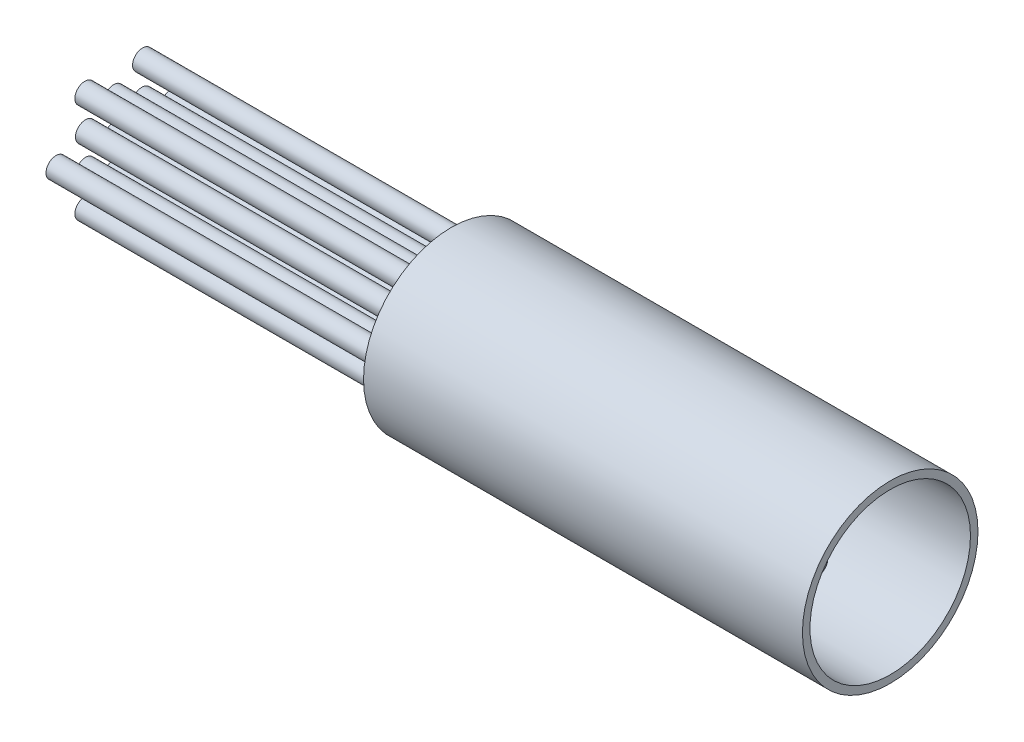
ISO-10303-21;
HEADER;
FILE_DESCRIPTION(('STEP AP214'),'2;1');
FILE_NAME('part.step','',(''),(''),'','','');
FILE_SCHEMA(('AUTOMOTIVE_DESIGN { 1 0 10303 214 1 1 1 1 }'));
ENDSEC;
DATA;
#1=APPLICATION_CONTEXT('core data for automotive mechanical design processes');
#2=APPLICATION_PROTOCOL_DEFINITION('international standard','automotive_design',2000,#1);
#3=PRODUCT_CONTEXT('',#1,'mechanical');
#4=PRODUCT('Part','Part','',(#3));
#5=PRODUCT_RELATED_PRODUCT_CATEGORY('part','',(#4));
#6=PRODUCT_DEFINITION_FORMATION('','',#4);
#7=PRODUCT_DEFINITION_CONTEXT('part definition',#1,'design');
#8=PRODUCT_DEFINITION('design','',#6,#7);
#9=PRODUCT_DEFINITION_SHAPE('','',#8);
#10=(LENGTH_UNIT() NAMED_UNIT(*) SI_UNIT(.MILLI.,.METRE.));
#11=(NAMED_UNIT(*) PLANE_ANGLE_UNIT() SI_UNIT($,.RADIAN.));
#12=(NAMED_UNIT(*) SI_UNIT($,.STERADIAN.) SOLID_ANGLE_UNIT());
#13=UNCERTAINTY_MEASURE_WITH_UNIT(LENGTH_MEASURE(1.E-05),#10,'distance_accuracy_value','');
#14=(GEOMETRIC_REPRESENTATION_CONTEXT(3) GLOBAL_UNCERTAINTY_ASSIGNED_CONTEXT((#13)) GLOBAL_UNIT_ASSIGNED_CONTEXT((#10,
#11,#12)) REPRESENTATION_CONTEXT('',''));
#15=CARTESIAN_POINT('',(0.,0.,0.));
#16=DIRECTION('',(0.,0.,1.));
#17=DIRECTION('',(1.,0.,0.));
#18=AXIS2_PLACEMENT_3D('',#15,#16,#17);
#19=CARTESIAN_POINT('',(-134.6,19.9185842870421,-11.4999999999999));
#20=DIRECTION('',(-1.,0.,0.));
#21=DIRECTION('',(0.,0.,1.));
#22=AXIS2_PLACEMENT_3D('',#19,#20,#21);
#23=PLANE('',#22);
#24=CARTESIAN_POINT('',(-134.6,19.9185842870421,-11.4999999999999));
#25=DIRECTION('',(-1.,0.,0.));
#26=DIRECTION('',(0.,0.,1.));
#27=AXIS2_PLACEMENT_3D('',#24,#25,#26);
#28=CIRCLE('',#27,4.);
#29=CARTESIAN_POINT('',(-134.6,19.9185842870421,-7.49999999999989));
#30=VERTEX_POINT('',#29);
#31=EDGE_CURVE('E11',#30,#30,#28,.T.);
#32=ORIENTED_EDGE('',*,*,#31,.T.);
#33=EDGE_LOOP('',(#32));
#34=FACE_BOUND('',#33,.T.);
#35=CARTESIAN_POINT('',(-134.6,19.9185842870421,-11.4999999999999));
#36=DIRECTION('',(-1.,0.,0.));
#37=DIRECTION('',(0.,0.,1.));
#38=AXIS2_PLACEMENT_3D('',#35,#36,#37);
#39=CIRCLE('',#38,3.00000000000001);
#40=CARTESIAN_POINT('',(-134.6,19.9185842870421,-8.49999999999988));
#41=VERTEX_POINT('',#40);
#42=EDGE_CURVE('E50',#41,#41,#39,.T.);
#43=ORIENTED_EDGE('',*,*,#42,.F.);
#44=EDGE_LOOP('',(#43));
#45=FACE_BOUND('',#44,.T.);
#46=ADVANCED_FACE('F43',(#34,#45),#23,.T.);
#47=CARTESIAN_POINT('',(-134.6,19.9185842870421,-11.4999999999999));
#48=DIRECTION('',(1.,0.,0.));
#49=DIRECTION('',(0.,0.,-1.));
#50=AXIS2_PLACEMENT_3D('',#47,#48,#49);
#51=CYLINDRICAL_SURFACE('',#50,4.);
#52=ORIENTED_EDGE('',*,*,#31,.F.);
#53=EDGE_LOOP('',(#52));
#54=FACE_BOUND('',#53,.T.);
#55=CARTESIAN_POINT('',(134.6,19.9185842870421,-11.4999999999999));
#56=DIRECTION('',(-1.,0.,0.));
#57=DIRECTION('',(0.,0.,1.));
#58=AXIS2_PLACEMENT_3D('',#55,#56,#57);
#59=CIRCLE('',#58,4.);
#60=CARTESIAN_POINT('',(134.6,19.9185842870421,-7.49999999999989));
#61=VERTEX_POINT('',#60);
#62=EDGE_CURVE('E54',#61,#61,#59,.T.);
#63=ORIENTED_EDGE('',*,*,#62,.T.);
#64=EDGE_LOOP('',(#63));
#65=FACE_BOUND('',#64,.T.);
#66=ADVANCED_FACE('F45',(#54,#65),#51,.T.);
#67=CARTESIAN_POINT('',(-134.6,19.9185842870421,-11.4999999999999));
#68=DIRECTION('',(1.,0.,0.));
#69=DIRECTION('',(0.,0.,-1.));
#70=AXIS2_PLACEMENT_3D('',#67,#68,#69);
#71=CYLINDRICAL_SURFACE('',#70,3.00000000000001);
#72=ORIENTED_EDGE('',*,*,#42,.T.);
#73=EDGE_LOOP('',(#72));
#74=FACE_BOUND('',#73,.T.);
#75=CARTESIAN_POINT('',(134.6,19.9185842870421,-11.4999999999999));
#76=DIRECTION('',(-1.,0.,0.));
#77=DIRECTION('',(0.,0.,1.));
#78=AXIS2_PLACEMENT_3D('',#75,#76,#77);
#79=CIRCLE('',#78,3.00000000000001);
#80=CARTESIAN_POINT('',(134.6,19.9185842870421,-8.49999999999988));
#81=VERTEX_POINT('',#80);
#82=EDGE_CURVE('E58',#81,#81,#79,.T.);
#83=ORIENTED_EDGE('',*,*,#82,.F.);
#84=EDGE_LOOP('',(#83));
#85=FACE_BOUND('',#84,.T.);
#86=ADVANCED_FACE('F67',(#74,#85),#71,.F.);
#87=CARTESIAN_POINT('',(134.6,19.9185842870421,-11.4999999999999));
#88=DIRECTION('',(-1.,0.,0.));
#89=DIRECTION('',(0.,0.,1.));
#90=AXIS2_PLACEMENT_3D('',#87,#88,#89);
#91=PLANE('',#90);
#92=ORIENTED_EDGE('',*,*,#82,.T.);
#93=EDGE_LOOP('',(#92));
#94=FACE_BOUND('',#93,.T.);
#95=ORIENTED_EDGE('',*,*,#62,.F.);
#96=EDGE_LOOP('',(#95));
#97=FACE_BOUND('',#96,.T.);
#98=ADVANCED_FACE('F64',(#94,#97),#91,.F.);
#99=CLOSED_SHELL('',(#46,#66,#86,#98));
#100=MANIFOLD_SOLID_BREP('B2',#99);
#101=CARTESIAN_POINT('',(-134.6,1.24544042034318E-13,-23.));
#102=DIRECTION('',(-1.,0.,0.));
#103=DIRECTION('',(0.,0.,1.));
#104=AXIS2_PLACEMENT_3D('',#101,#102,#103);
#105=PLANE('',#104);
#106=CARTESIAN_POINT('',(-134.6,1.24544042034318E-13,-23.));
#107=DIRECTION('',(-1.,0.,0.));
#108=DIRECTION('',(0.,0.,1.));
#109=AXIS2_PLACEMENT_3D('',#106,#107,#108);
#110=CIRCLE('',#109,4.);
#111=CARTESIAN_POINT('',(-134.6,1.24544042034318E-13,-19.));
#112=VERTEX_POINT('',#111);
#113=EDGE_CURVE('E42',#112,#112,#110,.T.);
#114=ORIENTED_EDGE('',*,*,#113,.T.);
#115=EDGE_LOOP('',(#114));
#116=FACE_BOUND('',#115,.T.);
#117=CARTESIAN_POINT('',(-134.6,1.24544042034318E-13,-23.));
#118=DIRECTION('',(-1.,0.,0.));
#119=DIRECTION('',(0.,0.,1.));
#120=AXIS2_PLACEMENT_3D('',#117,#118,#119);
#121=CIRCLE('',#120,3.);
#122=CARTESIAN_POINT('',(-134.6,1.24544042034318E-13,-20.));
#123=VERTEX_POINT('',#122);
#124=EDGE_CURVE('E119',#123,#123,#121,.T.);
#125=ORIENTED_EDGE('',*,*,#124,.F.);
#126=EDGE_LOOP('',(#125));
#127=FACE_BOUND('',#126,.T.);
#128=ADVANCED_FACE('F112',(#116,#127),#105,.T.);
#129=CARTESIAN_POINT('',(-134.6,1.24544042034318E-13,-23.));
#130=DIRECTION('',(1.,0.,0.));
#131=DIRECTION('',(0.,0.,-1.));
#132=AXIS2_PLACEMENT_3D('',#129,#130,#131);
#133=CYLINDRICAL_SURFACE('',#132,4.);
#134=ORIENTED_EDGE('',*,*,#113,.F.);
#135=EDGE_LOOP('',(#134));
#136=FACE_BOUND('',#135,.T.);
#137=CARTESIAN_POINT('',(134.6,1.24544042034318E-13,-23.));
#138=DIRECTION('',(-1.,0.,0.));
#139=DIRECTION('',(0.,0.,1.));
#140=AXIS2_PLACEMENT_3D('',#137,#138,#139);
#141=CIRCLE('',#140,4.);
#142=CARTESIAN_POINT('',(134.6,1.24544042034318E-13,-19.));
#143=VERTEX_POINT('',#142);
#144=EDGE_CURVE('E123',#143,#143,#141,.T.);
#145=ORIENTED_EDGE('',*,*,#144,.T.);
#146=EDGE_LOOP('',(#145));
#147=FACE_BOUND('',#146,.T.);
#148=ADVANCED_FACE('F114',(#136,#147),#133,.T.);
#149=CARTESIAN_POINT('',(-134.6,1.24544042034318E-13,-23.));
#150=DIRECTION('',(1.,0.,0.));
#151=DIRECTION('',(0.,0.,-1.));
#152=AXIS2_PLACEMENT_3D('',#149,#150,#151);
#153=CYLINDRICAL_SURFACE('',#152,3.);
#154=ORIENTED_EDGE('',*,*,#124,.T.);
#155=EDGE_LOOP('',(#154));
#156=FACE_BOUND('',#155,.T.);
#157=CARTESIAN_POINT('',(134.6,1.24544042034318E-13,-23.));
#158=DIRECTION('',(-1.,0.,0.));
#159=DIRECTION('',(0.,0.,1.));
#160=AXIS2_PLACEMENT_3D('',#157,#158,#159);
#161=CIRCLE('',#160,3.);
#162=CARTESIAN_POINT('',(134.6,1.24544042034318E-13,-20.));
#163=VERTEX_POINT('',#162);
#164=EDGE_CURVE('E127',#163,#163,#161,.T.);
#165=ORIENTED_EDGE('',*,*,#164,.F.);
#166=EDGE_LOOP('',(#165));
#167=FACE_BOUND('',#166,.T.);
#168=ADVANCED_FACE('F136',(#156,#167),#153,.F.);
#169=CARTESIAN_POINT('',(134.6,1.24544042034318E-13,-23.));
#170=DIRECTION('',(-1.,0.,0.));
#171=DIRECTION('',(0.,0.,1.));
#172=AXIS2_PLACEMENT_3D('',#169,#170,#171);
#173=PLANE('',#172);
#174=ORIENTED_EDGE('',*,*,#164,.T.);
#175=EDGE_LOOP('',(#174));
#176=FACE_BOUND('',#175,.T.);
#177=ORIENTED_EDGE('',*,*,#144,.F.);
#178=EDGE_LOOP('',(#177));
#179=FACE_BOUND('',#178,.T.);
#180=ADVANCED_FACE('F133',(#176,#179),#173,.F.);
#181=CLOSED_SHELL('',(#128,#148,#168,#180));
#182=MANIFOLD_SOLID_BREP('B6',#181);
#183=CARTESIAN_POINT('',(-134.6,-19.918584287042,-11.5000000000001));
#184=DIRECTION('',(-1.,0.,0.));
#185=DIRECTION('',(0.,0.,1.));
#186=AXIS2_PLACEMENT_3D('',#183,#184,#185);
#187=PLANE('',#186);
#188=CARTESIAN_POINT('',(-134.6,-19.918584287042,-11.5000000000001));
#189=DIRECTION('',(-1.,0.,0.));
#190=DIRECTION('',(0.,0.,1.));
#191=AXIS2_PLACEMENT_3D('',#188,#189,#190);
#192=CIRCLE('',#191,4.);
#193=CARTESIAN_POINT('',(-134.6,-19.918584287042,-7.5000000000001));
#194=VERTEX_POINT('',#193);
#195=EDGE_CURVE('E111',#194,#194,#192,.T.);
#196=ORIENTED_EDGE('',*,*,#195,.T.);
#197=EDGE_LOOP('',(#196));
#198=FACE_BOUND('',#197,.T.);
#199=CARTESIAN_POINT('',(-134.6,-19.918584287042,-11.5000000000001));
#200=DIRECTION('',(-1.,0.,0.));
#201=DIRECTION('',(0.,0.,1.));
#202=AXIS2_PLACEMENT_3D('',#199,#200,#201);
#203=CIRCLE('',#202,3.00000000000001);
#204=CARTESIAN_POINT('',(-134.6,-19.918584287042,-8.5000000000001));
#205=VERTEX_POINT('',#204);
#206=EDGE_CURVE('E188',#205,#205,#203,.T.);
#207=ORIENTED_EDGE('',*,*,#206,.F.);
#208=EDGE_LOOP('',(#207));
#209=FACE_BOUND('',#208,.T.);
#210=ADVANCED_FACE('F181',(#198,#209),#187,.T.);
#211=CARTESIAN_POINT('',(-134.6,-19.918584287042,-11.5000000000001));
#212=DIRECTION('',(1.,0.,0.));
#213=DIRECTION('',(0.,0.,-1.));
#214=AXIS2_PLACEMENT_3D('',#211,#212,#213);
#215=CYLINDRICAL_SURFACE('',#214,4.);
#216=ORIENTED_EDGE('',*,*,#195,.F.);
#217=EDGE_LOOP('',(#216));
#218=FACE_BOUND('',#217,.T.);
#219=CARTESIAN_POINT('',(134.6,-19.918584287042,-11.5000000000001));
#220=DIRECTION('',(-1.,0.,0.));
#221=DIRECTION('',(0.,0.,1.));
#222=AXIS2_PLACEMENT_3D('',#219,#220,#221);
#223=CIRCLE('',#222,4.);
#224=CARTESIAN_POINT('',(134.6,-19.918584287042,-7.5000000000001));
#225=VERTEX_POINT('',#224);
#226=EDGE_CURVE('E192',#225,#225,#223,.T.);
#227=ORIENTED_EDGE('',*,*,#226,.T.);
#228=EDGE_LOOP('',(#227));
#229=FACE_BOUND('',#228,.T.);
#230=ADVANCED_FACE('F183',(#218,#229),#215,.T.);
#231=CARTESIAN_POINT('',(-134.6,-19.918584287042,-11.5000000000001));
#232=DIRECTION('',(1.,0.,0.));
#233=DIRECTION('',(0.,0.,-1.));
#234=AXIS2_PLACEMENT_3D('',#231,#232,#233);
#235=CYLINDRICAL_SURFACE('',#234,3.00000000000001);
#236=ORIENTED_EDGE('',*,*,#206,.T.);
#237=EDGE_LOOP('',(#236));
#238=FACE_BOUND('',#237,.T.);
#239=CARTESIAN_POINT('',(134.6,-19.918584287042,-11.5000000000001));
#240=DIRECTION('',(-1.,0.,0.));
#241=DIRECTION('',(0.,0.,1.));
#242=AXIS2_PLACEMENT_3D('',#239,#240,#241);
#243=CIRCLE('',#242,3.00000000000001);
#244=CARTESIAN_POINT('',(134.6,-19.918584287042,-8.5000000000001));
#245=VERTEX_POINT('',#244);
#246=EDGE_CURVE('E196',#245,#245,#243,.T.);
#247=ORIENTED_EDGE('',*,*,#246,.F.);
#248=EDGE_LOOP('',(#247));
#249=FACE_BOUND('',#248,.T.);
#250=ADVANCED_FACE('F205',(#238,#249),#235,.F.);
#251=CARTESIAN_POINT('',(134.6,-19.918584287042,-11.5000000000001));
#252=DIRECTION('',(-1.,0.,0.));
#253=DIRECTION('',(0.,0.,1.));
#254=AXIS2_PLACEMENT_3D('',#251,#252,#253);
#255=PLANE('',#254);
#256=ORIENTED_EDGE('',*,*,#246,.T.);
#257=EDGE_LOOP('',(#256));
#258=FACE_BOUND('',#257,.T.);
#259=ORIENTED_EDGE('',*,*,#226,.F.);
#260=EDGE_LOOP('',(#259));
#261=FACE_BOUND('',#260,.T.);
#262=ADVANCED_FACE('F202',(#258,#261),#255,.F.);
#263=CLOSED_SHELL('',(#210,#230,#250,#262));
#264=MANIFOLD_SOLID_BREP('B37',#263);
#265=CARTESIAN_POINT('',(-134.6,-19.9185842870422,11.4999999999999));
#266=DIRECTION('',(-1.,0.,0.));
#267=DIRECTION('',(0.,0.,1.));
#268=AXIS2_PLACEMENT_3D('',#265,#266,#267);
#269=PLANE('',#268);
#270=CARTESIAN_POINT('',(-134.6,-19.9185842870422,11.4999999999999));
#271=DIRECTION('',(-1.,0.,0.));
#272=DIRECTION('',(0.,0.,1.));
#273=AXIS2_PLACEMENT_3D('',#270,#271,#272);
#274=CIRCLE('',#273,4.);
#275=CARTESIAN_POINT('',(-134.6,-19.9185842870422,15.4999999999999));
#276=VERTEX_POINT('',#275);
#277=EDGE_CURVE('E180',#276,#276,#274,.T.);
#278=ORIENTED_EDGE('',*,*,#277,.T.);
#279=EDGE_LOOP('',(#278));
#280=FACE_BOUND('',#279,.T.);
#281=CARTESIAN_POINT('',(-134.6,-19.9185842870422,11.4999999999999));
#282=DIRECTION('',(-1.,0.,0.));
#283=DIRECTION('',(0.,0.,1.));
#284=AXIS2_PLACEMENT_3D('',#281,#282,#283);
#285=CIRCLE('',#284,3.);
#286=CARTESIAN_POINT('',(-134.6,-19.9185842870422,14.4999999999999));
#287=VERTEX_POINT('',#286);
#288=EDGE_CURVE('E257',#287,#287,#285,.T.);
#289=ORIENTED_EDGE('',*,*,#288,.F.);
#290=EDGE_LOOP('',(#289));
#291=FACE_BOUND('',#290,.T.);
#292=ADVANCED_FACE('F250',(#280,#291),#269,.T.);
#293=CARTESIAN_POINT('',(-134.6,-19.9185842870422,11.4999999999999));
#294=DIRECTION('',(1.,0.,0.));
#295=DIRECTION('',(0.,0.,-1.));
#296=AXIS2_PLACEMENT_3D('',#293,#294,#295);
#297=CYLINDRICAL_SURFACE('',#296,4.);
#298=ORIENTED_EDGE('',*,*,#277,.F.);
#299=EDGE_LOOP('',(#298));
#300=FACE_BOUND('',#299,.T.);
#301=CARTESIAN_POINT('',(134.6,-19.9185842870422,11.4999999999999));
#302=DIRECTION('',(-1.,0.,0.));
#303=DIRECTION('',(0.,0.,1.));
#304=AXIS2_PLACEMENT_3D('',#301,#302,#303);
#305=CIRCLE('',#304,4.);
#306=CARTESIAN_POINT('',(134.6,-19.9185842870422,15.4999999999999));
#307=VERTEX_POINT('',#306);
#308=EDGE_CURVE('E261',#307,#307,#305,.T.);
#309=ORIENTED_EDGE('',*,*,#308,.T.);
#310=EDGE_LOOP('',(#309));
#311=FACE_BOUND('',#310,.T.);
#312=ADVANCED_FACE('F252',(#300,#311),#297,.T.);
#313=CARTESIAN_POINT('',(-134.6,-19.9185842870422,11.4999999999999));
#314=DIRECTION('',(1.,0.,0.));
#315=DIRECTION('',(0.,0.,-1.));
#316=AXIS2_PLACEMENT_3D('',#313,#314,#315);
#317=CYLINDRICAL_SURFACE('',#316,3.);
#318=ORIENTED_EDGE('',*,*,#288,.T.);
#319=EDGE_LOOP('',(#318));
#320=FACE_BOUND('',#319,.T.);
#321=CARTESIAN_POINT('',(134.6,-19.9185842870422,11.4999999999999));
#322=DIRECTION('',(-1.,0.,0.));
#323=DIRECTION('',(0.,0.,1.));
#324=AXIS2_PLACEMENT_3D('',#321,#322,#323);
#325=CIRCLE('',#324,3.);
#326=CARTESIAN_POINT('',(134.6,-19.9185842870422,14.4999999999999));
#327=VERTEX_POINT('',#326);
#328=EDGE_CURVE('E265',#327,#327,#325,.T.);
#329=ORIENTED_EDGE('',*,*,#328,.F.);
#330=EDGE_LOOP('',(#329));
#331=FACE_BOUND('',#330,.T.);
#332=ADVANCED_FACE('F274',(#320,#331),#317,.F.);
#333=CARTESIAN_POINT('',(134.6,-19.9185842870422,11.4999999999999));
#334=DIRECTION('',(-1.,0.,0.));
#335=DIRECTION('',(0.,0.,1.));
#336=AXIS2_PLACEMENT_3D('',#333,#334,#335);
#337=PLANE('',#336);
#338=ORIENTED_EDGE('',*,*,#328,.T.);
#339=EDGE_LOOP('',(#338));
#340=FACE_BOUND('',#339,.T.);
#341=ORIENTED_EDGE('',*,*,#308,.F.);
#342=EDGE_LOOP('',(#341));
#343=FACE_BOUND('',#342,.T.);
#344=ADVANCED_FACE('F271',(#340,#343),#337,.F.);
#345=CLOSED_SHELL('',(#292,#312,#332,#344));
#346=MANIFOLD_SOLID_BREP('B106',#345);
#347=CARTESIAN_POINT('',(-134.6,-1.24842197631751E-13,23.));
#348=DIRECTION('',(-1.,0.,0.));
#349=DIRECTION('',(0.,0.,1.));
#350=AXIS2_PLACEMENT_3D('',#347,#348,#349);
#351=PLANE('',#350);
#352=CARTESIAN_POINT('',(-134.6,-1.24842197631751E-13,23.));
#353=DIRECTION('',(-1.,0.,0.));
#354=DIRECTION('',(0.,0.,1.));
#355=AXIS2_PLACEMENT_3D('',#352,#353,#354);
#356=CIRCLE('',#355,4.);
#357=CARTESIAN_POINT('',(-134.6,-1.24842197631751E-13,27.));
#358=VERTEX_POINT('',#357);
#359=EDGE_CURVE('E249',#358,#358,#356,.T.);
#360=ORIENTED_EDGE('',*,*,#359,.T.);
#361=EDGE_LOOP('',(#360));
#362=FACE_BOUND('',#361,.T.);
#363=CARTESIAN_POINT('',(-134.6,-1.24842197631751E-13,23.));
#364=DIRECTION('',(-1.,0.,0.));
#365=DIRECTION('',(0.,0.,1.));
#366=AXIS2_PLACEMENT_3D('',#363,#364,#365);
#367=CIRCLE('',#366,3.);
#368=CARTESIAN_POINT('',(-134.6,-1.24842197631751E-13,26.));
#369=VERTEX_POINT('',#368);
#370=EDGE_CURVE('E326',#369,#369,#367,.T.);
#371=ORIENTED_EDGE('',*,*,#370,.F.);
#372=EDGE_LOOP('',(#371));
#373=FACE_BOUND('',#372,.T.);
#374=ADVANCED_FACE('F319',(#362,#373),#351,.T.);
#375=CARTESIAN_POINT('',(-134.6,-1.24842197631751E-13,23.));
#376=DIRECTION('',(1.,0.,0.));
#377=DIRECTION('',(0.,0.,-1.));
#378=AXIS2_PLACEMENT_3D('',#375,#376,#377);
#379=CYLINDRICAL_SURFACE('',#378,4.);
#380=ORIENTED_EDGE('',*,*,#359,.F.);
#381=EDGE_LOOP('',(#380));
#382=FACE_BOUND('',#381,.T.);
#383=CARTESIAN_POINT('',(134.6,-1.24842197631751E-13,23.));
#384=DIRECTION('',(-1.,0.,0.));
#385=DIRECTION('',(0.,0.,1.));
#386=AXIS2_PLACEMENT_3D('',#383,#384,#385);
#387=CIRCLE('',#386,4.);
#388=CARTESIAN_POINT('',(134.6,-1.24842197631751E-13,27.));
#389=VERTEX_POINT('',#388);
#390=EDGE_CURVE('E330',#389,#389,#387,.T.);
#391=ORIENTED_EDGE('',*,*,#390,.T.);
#392=EDGE_LOOP('',(#391));
#393=FACE_BOUND('',#392,.T.);
#394=ADVANCED_FACE('F321',(#382,#393),#379,.T.);
#395=CARTESIAN_POINT('',(-134.6,-1.24842197631751E-13,23.));
#396=DIRECTION('',(1.,0.,0.));
#397=DIRECTION('',(0.,0.,-1.));
#398=AXIS2_PLACEMENT_3D('',#395,#396,#397);
#399=CYLINDRICAL_SURFACE('',#398,3.);
#400=ORIENTED_EDGE('',*,*,#370,.T.);
#401=EDGE_LOOP('',(#400));
#402=FACE_BOUND('',#401,.T.);
#403=CARTESIAN_POINT('',(134.6,-1.24842197631751E-13,23.));
#404=DIRECTION('',(-1.,0.,0.));
#405=DIRECTION('',(0.,0.,1.));
#406=AXIS2_PLACEMENT_3D('',#403,#404,#405);
#407=CIRCLE('',#406,3.);
#408=CARTESIAN_POINT('',(134.6,-1.24842197631751E-13,26.));
#409=VERTEX_POINT('',#408);
#410=EDGE_CURVE('E334',#409,#409,#407,.T.);
#411=ORIENTED_EDGE('',*,*,#410,.F.);
#412=EDGE_LOOP('',(#411));
#413=FACE_BOUND('',#412,.T.);
#414=ADVANCED_FACE('F343',(#402,#413),#399,.F.);
#415=CARTESIAN_POINT('',(134.6,-1.24842197631751E-13,23.));
#416=DIRECTION('',(-1.,0.,0.));
#417=DIRECTION('',(0.,0.,1.));
#418=AXIS2_PLACEMENT_3D('',#415,#416,#417);
#419=PLANE('',#418);
#420=ORIENTED_EDGE('',*,*,#410,.T.);
#421=EDGE_LOOP('',(#420));
#422=FACE_BOUND('',#421,.T.);
#423=ORIENTED_EDGE('',*,*,#390,.F.);
#424=EDGE_LOOP('',(#423));
#425=FACE_BOUND('',#424,.T.);
#426=ADVANCED_FACE('F340',(#422,#425),#419,.F.);
#427=CLOSED_SHELL('',(#374,#394,#414,#426));
#428=MANIFOLD_SOLID_BREP('B175',#427);
#429=CARTESIAN_POINT('',(-134.6,19.918584287042,11.5000000000001));
#430=DIRECTION('',(-1.,0.,0.));
#431=DIRECTION('',(0.,0.,1.));
#432=AXIS2_PLACEMENT_3D('',#429,#430,#431);
#433=PLANE('',#432);
#434=CARTESIAN_POINT('',(-134.6,19.918584287042,11.5000000000001));
#435=DIRECTION('',(-1.,0.,0.));
#436=DIRECTION('',(0.,0.,1.));
#437=AXIS2_PLACEMENT_3D('',#434,#435,#436);
#438=CIRCLE('',#437,4.00000000000001);
#439=CARTESIAN_POINT('',(-134.6,19.918584287042,15.5000000000001));
#440=VERTEX_POINT('',#439);
#441=EDGE_CURVE('E318',#440,#440,#438,.T.);
#442=ORIENTED_EDGE('',*,*,#441,.T.);
#443=EDGE_LOOP('',(#442));
#444=FACE_BOUND('',#443,.T.);
#445=CARTESIAN_POINT('',(-134.6,19.918584287042,11.5000000000001));
#446=DIRECTION('',(-1.,0.,0.));
#447=DIRECTION('',(0.,0.,1.));
#448=AXIS2_PLACEMENT_3D('',#445,#446,#447);
#449=CIRCLE('',#448,3.00000000000001);
#450=CARTESIAN_POINT('',(-134.6,19.918584287042,14.5000000000001));
#451=VERTEX_POINT('',#450);
#452=EDGE_CURVE('E395',#451,#451,#449,.T.);
#453=ORIENTED_EDGE('',*,*,#452,.F.);
#454=EDGE_LOOP('',(#453));
#455=FACE_BOUND('',#454,.T.);
#456=ADVANCED_FACE('F388',(#444,#455),#433,.T.);
#457=CARTESIAN_POINT('',(-134.6,19.918584287042,11.5000000000001));
#458=DIRECTION('',(1.,0.,0.));
#459=DIRECTION('',(0.,0.,-1.));
#460=AXIS2_PLACEMENT_3D('',#457,#458,#459);
#461=CYLINDRICAL_SURFACE('',#460,4.00000000000001);
#462=ORIENTED_EDGE('',*,*,#441,.F.);
#463=EDGE_LOOP('',(#462));
#464=FACE_BOUND('',#463,.T.);
#465=CARTESIAN_POINT('',(134.6,19.918584287042,11.5000000000001));
#466=DIRECTION('',(-1.,0.,0.));
#467=DIRECTION('',(0.,0.,1.));
#468=AXIS2_PLACEMENT_3D('',#465,#466,#467);
#469=CIRCLE('',#468,4.00000000000001);
#470=CARTESIAN_POINT('',(134.6,19.918584287042,15.5000000000001));
#471=VERTEX_POINT('',#470);
#472=EDGE_CURVE('E399',#471,#471,#469,.T.);
#473=ORIENTED_EDGE('',*,*,#472,.T.);
#474=EDGE_LOOP('',(#473));
#475=FACE_BOUND('',#474,.T.);
#476=ADVANCED_FACE('F390',(#464,#475),#461,.T.);
#477=CARTESIAN_POINT('',(-134.6,19.918584287042,11.5000000000001));
#478=DIRECTION('',(1.,0.,0.));
#479=DIRECTION('',(0.,0.,-1.));
#480=AXIS2_PLACEMENT_3D('',#477,#478,#479);
#481=CYLINDRICAL_SURFACE('',#480,3.00000000000001);
#482=ORIENTED_EDGE('',*,*,#452,.T.);
#483=EDGE_LOOP('',(#482));
#484=FACE_BOUND('',#483,.T.);
#485=CARTESIAN_POINT('',(134.6,19.918584287042,11.5000000000001));
#486=DIRECTION('',(-1.,0.,0.));
#487=DIRECTION('',(0.,0.,1.));
#488=AXIS2_PLACEMENT_3D('',#485,#486,#487);
#489=CIRCLE('',#488,3.00000000000001);
#490=CARTESIAN_POINT('',(134.6,19.918584287042,14.5000000000001));
#491=VERTEX_POINT('',#490);
#492=EDGE_CURVE('E403',#491,#491,#489,.T.);
#493=ORIENTED_EDGE('',*,*,#492,.F.);
#494=EDGE_LOOP('',(#493));
#495=FACE_BOUND('',#494,.T.);
#496=ADVANCED_FACE('F412',(#484,#495),#481,.F.);
#497=CARTESIAN_POINT('',(134.6,19.918584287042,11.5000000000001));
#498=DIRECTION('',(-1.,0.,0.));
#499=DIRECTION('',(0.,0.,1.));
#500=AXIS2_PLACEMENT_3D('',#497,#498,#499);
#501=PLANE('',#500);
#502=ORIENTED_EDGE('',*,*,#492,.T.);
#503=EDGE_LOOP('',(#502));
#504=FACE_BOUND('',#503,.T.);
#505=ORIENTED_EDGE('',*,*,#472,.F.);
#506=EDGE_LOOP('',(#505));
#507=FACE_BOUND('',#506,.T.);
#508=ADVANCED_FACE('F409',(#504,#507),#501,.F.);
#509=CLOSED_SHELL('',(#456,#476,#496,#508));
#510=MANIFOLD_SOLID_BREP('B244',#509);
#511=CARTESIAN_POINT('',(-134.6,6.49999999999999,-11.2583302491977));
#512=DIRECTION('',(-1.,0.,0.));
#513=DIRECTION('',(0.,0.,1.));
#514=AXIS2_PLACEMENT_3D('',#511,#512,#513);
#515=PLANE('',#514);
#516=CARTESIAN_POINT('',(-134.6,6.49999999999999,-11.2583302491977));
#517=DIRECTION('',(-1.,0.,0.));
#518=DIRECTION('',(0.,0.,1.));
#519=AXIS2_PLACEMENT_3D('',#516,#517,#518);
#520=CIRCLE('',#519,4.);
#521=CARTESIAN_POINT('',(-134.6,6.49999999999999,-7.25833024919771));
#522=VERTEX_POINT('',#521);
#523=EDGE_CURVE('E387',#522,#522,#520,.T.);
#524=ORIENTED_EDGE('',*,*,#523,.T.);
#525=EDGE_LOOP('',(#524));
#526=FACE_BOUND('',#525,.T.);
#527=CARTESIAN_POINT('',(-134.6,6.49999999999999,-11.2583302491977));
#528=DIRECTION('',(-1.,0.,0.));
#529=DIRECTION('',(0.,0.,1.));
#530=AXIS2_PLACEMENT_3D('',#527,#528,#529);
#531=CIRCLE('',#530,3.);
#532=CARTESIAN_POINT('',(-134.6,6.49999999999999,-8.25833024919771));
#533=VERTEX_POINT('',#532);
#534=EDGE_CURVE('E464',#533,#533,#531,.T.);
#535=ORIENTED_EDGE('',*,*,#534,.F.);
#536=EDGE_LOOP('',(#535));
#537=FACE_BOUND('',#536,.T.);
#538=ADVANCED_FACE('F457',(#526,#537),#515,.T.);
#539=CARTESIAN_POINT('',(-134.6,6.49999999999999,-11.2583302491977));
#540=DIRECTION('',(1.,0.,0.));
#541=DIRECTION('',(0.,0.,-1.));
#542=AXIS2_PLACEMENT_3D('',#539,#540,#541);
#543=CYLINDRICAL_SURFACE('',#542,4.);
#544=ORIENTED_EDGE('',*,*,#523,.F.);
#545=EDGE_LOOP('',(#544));
#546=FACE_BOUND('',#545,.T.);
#547=CARTESIAN_POINT('',(134.6,6.49999999999999,-11.2583302491977));
#548=DIRECTION('',(-1.,0.,0.));
#549=DIRECTION('',(0.,0.,1.));
#550=AXIS2_PLACEMENT_3D('',#547,#548,#549);
#551=CIRCLE('',#550,4.);
#552=CARTESIAN_POINT('',(134.6,6.49999999999999,-7.25833024919771));
#553=VERTEX_POINT('',#552);
#554=EDGE_CURVE('E468',#553,#553,#551,.T.);
#555=ORIENTED_EDGE('',*,*,#554,.T.);
#556=EDGE_LOOP('',(#555));
#557=FACE_BOUND('',#556,.T.);
#558=ADVANCED_FACE('F459',(#546,#557),#543,.T.);
#559=CARTESIAN_POINT('',(-134.6,6.49999999999999,-11.2583302491977));
#560=DIRECTION('',(1.,0.,0.));
#561=DIRECTION('',(0.,0.,-1.));
#562=AXIS2_PLACEMENT_3D('',#559,#560,#561);
#563=CYLINDRICAL_SURFACE('',#562,3.);
#564=ORIENTED_EDGE('',*,*,#534,.T.);
#565=EDGE_LOOP('',(#564));
#566=FACE_BOUND('',#565,.T.);
#567=CARTESIAN_POINT('',(134.6,6.49999999999999,-11.2583302491977));
#568=DIRECTION('',(-1.,0.,0.));
#569=DIRECTION('',(0.,0.,1.));
#570=AXIS2_PLACEMENT_3D('',#567,#568,#569);
#571=CIRCLE('',#570,3.);
#572=CARTESIAN_POINT('',(134.6,6.49999999999999,-8.25833024919771));
#573=VERTEX_POINT('',#572);
#574=EDGE_CURVE('E472',#573,#573,#571,.T.);
#575=ORIENTED_EDGE('',*,*,#574,.F.);
#576=EDGE_LOOP('',(#575));
#577=FACE_BOUND('',#576,.T.);
#578=ADVANCED_FACE('F481',(#566,#577),#563,.F.);
#579=CARTESIAN_POINT('',(134.6,6.49999999999999,-11.2583302491977));
#580=DIRECTION('',(-1.,0.,0.));
#581=DIRECTION('',(0.,0.,1.));
#582=AXIS2_PLACEMENT_3D('',#579,#580,#581);
#583=PLANE('',#582);
#584=ORIENTED_EDGE('',*,*,#574,.T.);
#585=EDGE_LOOP('',(#584));
#586=FACE_BOUND('',#585,.T.);
#587=ORIENTED_EDGE('',*,*,#554,.F.);
#588=EDGE_LOOP('',(#587));
#589=FACE_BOUND('',#588,.T.);
#590=ADVANCED_FACE('F478',(#586,#589),#583,.F.);
#591=CLOSED_SHELL('',(#538,#558,#578,#590));
#592=MANIFOLD_SOLID_BREP('B313',#591);
#593=CARTESIAN_POINT('',(-134.6,-6.50000000000001,-11.2583302491977));
#594=DIRECTION('',(-1.,0.,0.));
#595=DIRECTION('',(0.,0.,1.));
#596=AXIS2_PLACEMENT_3D('',#593,#594,#595);
#597=PLANE('',#596);
#598=CARTESIAN_POINT('',(-134.6,-6.50000000000001,-11.2583302491977));
#599=DIRECTION('',(-1.,0.,0.));
#600=DIRECTION('',(0.,0.,1.));
#601=AXIS2_PLACEMENT_3D('',#598,#599,#600);
#602=CIRCLE('',#601,4.);
#603=CARTESIAN_POINT('',(-134.6,-6.50000000000001,-7.2583302491977));
#604=VERTEX_POINT('',#603);
#605=EDGE_CURVE('E456',#604,#604,#602,.T.);
#606=ORIENTED_EDGE('',*,*,#605,.T.);
#607=EDGE_LOOP('',(#606));
#608=FACE_BOUND('',#607,.T.);
#609=CARTESIAN_POINT('',(-134.6,-6.50000000000001,-11.2583302491977));
#610=DIRECTION('',(-1.,0.,0.));
#611=DIRECTION('',(0.,0.,1.));
#612=AXIS2_PLACEMENT_3D('',#609,#610,#611);
#613=CIRCLE('',#612,3.);
#614=CARTESIAN_POINT('',(-134.6,-6.50000000000001,-8.25833024919769));
#615=VERTEX_POINT('',#614);
#616=EDGE_CURVE('E533',#615,#615,#613,.T.);
#617=ORIENTED_EDGE('',*,*,#616,.F.);
#618=EDGE_LOOP('',(#617));
#619=FACE_BOUND('',#618,.T.);
#620=ADVANCED_FACE('F526',(#608,#619),#597,.T.);
#621=CARTESIAN_POINT('',(-134.6,-6.50000000000001,-11.2583302491977));
#622=DIRECTION('',(1.,0.,0.));
#623=DIRECTION('',(0.,0.,-1.));
#624=AXIS2_PLACEMENT_3D('',#621,#622,#623);
#625=CYLINDRICAL_SURFACE('',#624,4.);
#626=ORIENTED_EDGE('',*,*,#605,.F.);
#627=EDGE_LOOP('',(#626));
#628=FACE_BOUND('',#627,.T.);
#629=CARTESIAN_POINT('',(134.6,-6.50000000000001,-11.2583302491977));
#630=DIRECTION('',(-1.,0.,0.));
#631=DIRECTION('',(0.,0.,1.));
#632=AXIS2_PLACEMENT_3D('',#629,#630,#631);
#633=CIRCLE('',#632,4.);
#634=CARTESIAN_POINT('',(134.6,-6.50000000000001,-7.2583302491977));
#635=VERTEX_POINT('',#634);
#636=EDGE_CURVE('E537',#635,#635,#633,.T.);
#637=ORIENTED_EDGE('',*,*,#636,.T.);
#638=EDGE_LOOP('',(#637));
#639=FACE_BOUND('',#638,.T.);
#640=ADVANCED_FACE('F528',(#628,#639),#625,.T.);
#641=CARTESIAN_POINT('',(-134.6,-6.50000000000001,-11.2583302491977));
#642=DIRECTION('',(1.,0.,0.));
#643=DIRECTION('',(0.,0.,-1.));
#644=AXIS2_PLACEMENT_3D('',#641,#642,#643);
#645=CYLINDRICAL_SURFACE('',#644,3.);
#646=ORIENTED_EDGE('',*,*,#616,.T.);
#647=EDGE_LOOP('',(#646));
#648=FACE_BOUND('',#647,.T.);
#649=CARTESIAN_POINT('',(134.6,-6.50000000000001,-11.2583302491977));
#650=DIRECTION('',(-1.,0.,0.));
#651=DIRECTION('',(0.,0.,1.));
#652=AXIS2_PLACEMENT_3D('',#649,#650,#651);
#653=CIRCLE('',#652,3.);
#654=CARTESIAN_POINT('',(134.6,-6.50000000000001,-8.25833024919769));
#655=VERTEX_POINT('',#654);
#656=EDGE_CURVE('E541',#655,#655,#653,.T.);
#657=ORIENTED_EDGE('',*,*,#656,.F.);
#658=EDGE_LOOP('',(#657));
#659=FACE_BOUND('',#658,.T.);
#660=ADVANCED_FACE('F550',(#648,#659),#645,.F.);
#661=CARTESIAN_POINT('',(134.6,-6.50000000000001,-11.2583302491977));
#662=DIRECTION('',(-1.,0.,0.));
#663=DIRECTION('',(0.,0.,1.));
#664=AXIS2_PLACEMENT_3D('',#661,#662,#663);
#665=PLANE('',#664);
#666=ORIENTED_EDGE('',*,*,#656,.T.);
#667=EDGE_LOOP('',(#666));
#668=FACE_BOUND('',#667,.T.);
#669=ORIENTED_EDGE('',*,*,#636,.F.);
#670=EDGE_LOOP('',(#669));
#671=FACE_BOUND('',#670,.T.);
#672=ADVANCED_FACE('F547',(#668,#671),#665,.F.);
#673=CLOSED_SHELL('',(#620,#640,#660,#672));
#674=MANIFOLD_SOLID_BREP('B382',#673);
#675=CARTESIAN_POINT('',(-134.6,-13.,0.));
#676=DIRECTION('',(-1.,0.,0.));
#677=DIRECTION('',(0.,0.,1.));
#678=AXIS2_PLACEMENT_3D('',#675,#676,#677);
#679=PLANE('',#678);
#680=CARTESIAN_POINT('',(-134.6,-13.,0.));
#681=DIRECTION('',(-1.,0.,0.));
#682=DIRECTION('',(0.,0.,1.));
#683=AXIS2_PLACEMENT_3D('',#680,#681,#682);
#684=CIRCLE('',#683,4.);
#685=CARTESIAN_POINT('',(-134.6,-13.,4.));
#686=VERTEX_POINT('',#685);
#687=EDGE_CURVE('E525',#686,#686,#684,.T.);
#688=ORIENTED_EDGE('',*,*,#687,.T.);
#689=EDGE_LOOP('',(#688));
#690=FACE_BOUND('',#689,.T.);
#691=CARTESIAN_POINT('',(-134.6,-13.,0.));
#692=DIRECTION('',(-1.,0.,0.));
#693=DIRECTION('',(0.,0.,1.));
#694=AXIS2_PLACEMENT_3D('',#691,#692,#693);
#695=CIRCLE('',#694,3.);
#696=CARTESIAN_POINT('',(-134.6,-13.,3.));
#697=VERTEX_POINT('',#696);
#698=EDGE_CURVE('E602',#697,#697,#695,.T.);
#699=ORIENTED_EDGE('',*,*,#698,.F.);
#700=EDGE_LOOP('',(#699));
#701=FACE_BOUND('',#700,.T.);
#702=ADVANCED_FACE('F595',(#690,#701),#679,.T.);
#703=CARTESIAN_POINT('',(-134.6,-13.,0.));
#704=DIRECTION('',(1.,0.,0.));
#705=DIRECTION('',(0.,0.,-1.));
#706=AXIS2_PLACEMENT_3D('',#703,#704,#705);
#707=CYLINDRICAL_SURFACE('',#706,4.);
#708=ORIENTED_EDGE('',*,*,#687,.F.);
#709=EDGE_LOOP('',(#708));
#710=FACE_BOUND('',#709,.T.);
#711=CARTESIAN_POINT('',(134.6,-13.,0.));
#712=DIRECTION('',(-1.,0.,0.));
#713=DIRECTION('',(0.,0.,1.));
#714=AXIS2_PLACEMENT_3D('',#711,#712,#713);
#715=CIRCLE('',#714,4.);
#716=CARTESIAN_POINT('',(134.6,-13.,4.));
#717=VERTEX_POINT('',#716);
#718=EDGE_CURVE('E606',#717,#717,#715,.T.);
#719=ORIENTED_EDGE('',*,*,#718,.T.);
#720=EDGE_LOOP('',(#719));
#721=FACE_BOUND('',#720,.T.);
#722=ADVANCED_FACE('F597',(#710,#721),#707,.T.);
#723=CARTESIAN_POINT('',(-134.6,-13.,0.));
#724=DIRECTION('',(1.,0.,0.));
#725=DIRECTION('',(0.,0.,-1.));
#726=AXIS2_PLACEMENT_3D('',#723,#724,#725);
#727=CYLINDRICAL_SURFACE('',#726,3.);
#728=ORIENTED_EDGE('',*,*,#698,.T.);
#729=EDGE_LOOP('',(#728));
#730=FACE_BOUND('',#729,.T.);
#731=CARTESIAN_POINT('',(134.6,-13.,0.));
#732=DIRECTION('',(-1.,0.,0.));
#733=DIRECTION('',(0.,0.,1.));
#734=AXIS2_PLACEMENT_3D('',#731,#732,#733);
#735=CIRCLE('',#734,3.);
#736=CARTESIAN_POINT('',(134.6,-13.,3.));
#737=VERTEX_POINT('',#736);
#738=EDGE_CURVE('E610',#737,#737,#735,.T.);
#739=ORIENTED_EDGE('',*,*,#738,.F.);
#740=EDGE_LOOP('',(#739));
#741=FACE_BOUND('',#740,.T.);
#742=ADVANCED_FACE('F619',(#730,#741),#727,.F.);
#743=CARTESIAN_POINT('',(134.6,-13.,0.));
#744=DIRECTION('',(-1.,0.,0.));
#745=DIRECTION('',(0.,0.,1.));
#746=AXIS2_PLACEMENT_3D('',#743,#744,#745);
#747=PLANE('',#746);
#748=ORIENTED_EDGE('',*,*,#738,.T.);
#749=EDGE_LOOP('',(#748));
#750=FACE_BOUND('',#749,.T.);
#751=ORIENTED_EDGE('',*,*,#718,.F.);
#752=EDGE_LOOP('',(#751));
#753=FACE_BOUND('',#752,.T.);
#754=ADVANCED_FACE('F616',(#750,#753),#747,.F.);
#755=CLOSED_SHELL('',(#702,#722,#742,#754));
#756=MANIFOLD_SOLID_BREP('B451',#755);
#757=CARTESIAN_POINT('',(-134.6,-6.5,11.2583302491977));
#758=DIRECTION('',(-1.,0.,0.));
#759=DIRECTION('',(0.,0.,1.));
#760=AXIS2_PLACEMENT_3D('',#757,#758,#759);
#761=PLANE('',#760);
#762=CARTESIAN_POINT('',(-134.6,-6.5,11.2583302491977));
#763=DIRECTION('',(-1.,0.,0.));
#764=DIRECTION('',(0.,0.,1.));
#765=AXIS2_PLACEMENT_3D('',#762,#763,#764);
#766=CIRCLE('',#765,4.);
#767=CARTESIAN_POINT('',(-134.6,-6.5,15.2583302491977));
#768=VERTEX_POINT('',#767);
#769=EDGE_CURVE('E594',#768,#768,#766,.T.);
#770=ORIENTED_EDGE('',*,*,#769,.T.);
#771=EDGE_LOOP('',(#770));
#772=FACE_BOUND('',#771,.T.);
#773=CARTESIAN_POINT('',(-134.6,-6.5,11.2583302491977));
#774=DIRECTION('',(-1.,0.,0.));
#775=DIRECTION('',(0.,0.,1.));
#776=AXIS2_PLACEMENT_3D('',#773,#774,#775);
#777=CIRCLE('',#776,3.);
#778=CARTESIAN_POINT('',(-134.6,-6.5,14.2583302491977));
#779=VERTEX_POINT('',#778);
#780=EDGE_CURVE('E671',#779,#779,#777,.T.);
#781=ORIENTED_EDGE('',*,*,#780,.F.);
#782=EDGE_LOOP('',(#781));
#783=FACE_BOUND('',#782,.T.);
#784=ADVANCED_FACE('F664',(#772,#783),#761,.T.);
#785=CARTESIAN_POINT('',(-134.6,-6.5,11.2583302491977));
#786=DIRECTION('',(1.,0.,0.));
#787=DIRECTION('',(0.,0.,-1.));
#788=AXIS2_PLACEMENT_3D('',#785,#786,#787);
#789=CYLINDRICAL_SURFACE('',#788,4.);
#790=ORIENTED_EDGE('',*,*,#769,.F.);
#791=EDGE_LOOP('',(#790));
#792=FACE_BOUND('',#791,.T.);
#793=CARTESIAN_POINT('',(134.6,-6.5,11.2583302491977));
#794=DIRECTION('',(-1.,0.,0.));
#795=DIRECTION('',(0.,0.,1.));
#796=AXIS2_PLACEMENT_3D('',#793,#794,#795);
#797=CIRCLE('',#796,4.);
#798=CARTESIAN_POINT('',(134.6,-6.5,15.2583302491977));
#799=VERTEX_POINT('',#798);
#800=EDGE_CURVE('E675',#799,#799,#797,.T.);
#801=ORIENTED_EDGE('',*,*,#800,.T.);
#802=EDGE_LOOP('',(#801));
#803=FACE_BOUND('',#802,.T.);
#804=ADVANCED_FACE('F666',(#792,#803),#789,.T.);
#805=CARTESIAN_POINT('',(-134.6,-6.5,11.2583302491977));
#806=DIRECTION('',(1.,0.,0.));
#807=DIRECTION('',(0.,0.,-1.));
#808=AXIS2_PLACEMENT_3D('',#805,#806,#807);
#809=CYLINDRICAL_SURFACE('',#808,3.);
#810=ORIENTED_EDGE('',*,*,#780,.T.);
#811=EDGE_LOOP('',(#810));
#812=FACE_BOUND('',#811,.T.);
#813=CARTESIAN_POINT('',(134.6,-6.5,11.2583302491977));
#814=DIRECTION('',(-1.,0.,0.));
#815=DIRECTION('',(0.,0.,1.));
#816=AXIS2_PLACEMENT_3D('',#813,#814,#815);
#817=CIRCLE('',#816,3.);
#818=CARTESIAN_POINT('',(134.6,-6.5,14.2583302491977));
#819=VERTEX_POINT('',#818);
#820=EDGE_CURVE('E679',#819,#819,#817,.T.);
#821=ORIENTED_EDGE('',*,*,#820,.F.);
#822=EDGE_LOOP('',(#821));
#823=FACE_BOUND('',#822,.T.);
#824=ADVANCED_FACE('F688',(#812,#823),#809,.F.);
#825=CARTESIAN_POINT('',(134.6,-6.5,11.2583302491977));
#826=DIRECTION('',(-1.,0.,0.));
#827=DIRECTION('',(0.,0.,1.));
#828=AXIS2_PLACEMENT_3D('',#825,#826,#827);
#829=PLANE('',#828);
#830=ORIENTED_EDGE('',*,*,#820,.T.);
#831=EDGE_LOOP('',(#830));
#832=FACE_BOUND('',#831,.T.);
#833=ORIENTED_EDGE('',*,*,#800,.F.);
#834=EDGE_LOOP('',(#833));
#835=FACE_BOUND('',#834,.T.);
#836=ADVANCED_FACE('F685',(#832,#835),#829,.F.);
#837=CLOSED_SHELL('',(#784,#804,#824,#836));
#838=MANIFOLD_SOLID_BREP('B520',#837);
#839=CARTESIAN_POINT('',(-134.6,6.5,11.2583302491977));
#840=DIRECTION('',(-1.,0.,0.));
#841=DIRECTION('',(0.,0.,1.));
#842=AXIS2_PLACEMENT_3D('',#839,#840,#841);
#843=PLANE('',#842);
#844=CARTESIAN_POINT('',(-134.6,6.5,11.2583302491977));
#845=DIRECTION('',(-1.,0.,0.));
#846=DIRECTION('',(0.,0.,1.));
#847=AXIS2_PLACEMENT_3D('',#844,#845,#846);
#848=CIRCLE('',#847,4.);
#849=CARTESIAN_POINT('',(-134.6,6.5,15.2583302491977));
#850=VERTEX_POINT('',#849);
#851=EDGE_CURVE('E663',#850,#850,#848,.T.);
#852=ORIENTED_EDGE('',*,*,#851,.T.);
#853=EDGE_LOOP('',(#852));
#854=FACE_BOUND('',#853,.T.);
#855=CARTESIAN_POINT('',(-134.6,6.5,11.2583302491977));
#856=DIRECTION('',(-1.,0.,0.));
#857=DIRECTION('',(0.,0.,1.));
#858=AXIS2_PLACEMENT_3D('',#855,#856,#857);
#859=CIRCLE('',#858,3.);
#860=CARTESIAN_POINT('',(-134.6,6.5,14.2583302491977));
#861=VERTEX_POINT('',#860);
#862=EDGE_CURVE('E740',#861,#861,#859,.T.);
#863=ORIENTED_EDGE('',*,*,#862,.F.);
#864=EDGE_LOOP('',(#863));
#865=FACE_BOUND('',#864,.T.);
#866=ADVANCED_FACE('F733',(#854,#865),#843,.T.);
#867=CARTESIAN_POINT('',(-134.6,6.5,11.2583302491977));
#868=DIRECTION('',(1.,0.,0.));
#869=DIRECTION('',(0.,0.,-1.));
#870=AXIS2_PLACEMENT_3D('',#867,#868,#869);
#871=CYLINDRICAL_SURFACE('',#870,4.);
#872=ORIENTED_EDGE('',*,*,#851,.F.);
#873=EDGE_LOOP('',(#872));
#874=FACE_BOUND('',#873,.T.);
#875=CARTESIAN_POINT('',(134.6,6.5,11.2583302491977));
#876=DIRECTION('',(-1.,0.,0.));
#877=DIRECTION('',(0.,0.,1.));
#878=AXIS2_PLACEMENT_3D('',#875,#876,#877);
#879=CIRCLE('',#878,4.);
#880=CARTESIAN_POINT('',(134.6,6.5,15.2583302491977));
#881=VERTEX_POINT('',#880);
#882=EDGE_CURVE('E744',#881,#881,#879,.T.);
#883=ORIENTED_EDGE('',*,*,#882,.T.);
#884=EDGE_LOOP('',(#883));
#885=FACE_BOUND('',#884,.T.);
#886=ADVANCED_FACE('F735',(#874,#885),#871,.T.);
#887=CARTESIAN_POINT('',(-134.6,6.5,11.2583302491977));
#888=DIRECTION('',(1.,0.,0.));
#889=DIRECTION('',(0.,0.,-1.));
#890=AXIS2_PLACEMENT_3D('',#887,#888,#889);
#891=CYLINDRICAL_SURFACE('',#890,3.);
#892=ORIENTED_EDGE('',*,*,#862,.T.);
#893=EDGE_LOOP('',(#892));
#894=FACE_BOUND('',#893,.T.);
#895=CARTESIAN_POINT('',(134.6,6.5,11.2583302491977));
#896=DIRECTION('',(-1.,0.,0.));
#897=DIRECTION('',(0.,0.,1.));
#898=AXIS2_PLACEMENT_3D('',#895,#896,#897);
#899=CIRCLE('',#898,3.);
#900=CARTESIAN_POINT('',(134.6,6.5,14.2583302491977));
#901=VERTEX_POINT('',#900);
#902=EDGE_CURVE('E748',#901,#901,#899,.T.);
#903=ORIENTED_EDGE('',*,*,#902,.F.);
#904=EDGE_LOOP('',(#903));
#905=FACE_BOUND('',#904,.T.);
#906=ADVANCED_FACE('F757',(#894,#905),#891,.F.);
#907=CARTESIAN_POINT('',(134.6,6.5,11.2583302491977));
#908=DIRECTION('',(-1.,0.,0.));
#909=DIRECTION('',(0.,0.,1.));
#910=AXIS2_PLACEMENT_3D('',#907,#908,#909);
#911=PLANE('',#910);
#912=ORIENTED_EDGE('',*,*,#902,.T.);
#913=EDGE_LOOP('',(#912));
#914=FACE_BOUND('',#913,.T.);
#915=ORIENTED_EDGE('',*,*,#882,.F.);
#916=EDGE_LOOP('',(#915));
#917=FACE_BOUND('',#916,.T.);
#918=ADVANCED_FACE('F754',(#914,#917),#911,.F.);
#919=CLOSED_SHELL('',(#866,#886,#906,#918));
#920=MANIFOLD_SOLID_BREP('B589',#919);
#921=CARTESIAN_POINT('',(-134.6,13.,0.));
#922=DIRECTION('',(-1.,0.,0.));
#923=DIRECTION('',(0.,0.,1.));
#924=AXIS2_PLACEMENT_3D('',#921,#922,#923);
#925=PLANE('',#924);
#926=CARTESIAN_POINT('',(-134.6,13.,0.));
#927=DIRECTION('',(-1.,0.,0.));
#928=DIRECTION('',(0.,0.,1.));
#929=AXIS2_PLACEMENT_3D('',#926,#927,#928);
#930=CIRCLE('',#929,4.);
#931=CARTESIAN_POINT('',(-134.6,13.,4.));
#932=VERTEX_POINT('',#931);
#933=EDGE_CURVE('E732',#932,#932,#930,.T.);
#934=ORIENTED_EDGE('',*,*,#933,.T.);
#935=EDGE_LOOP('',(#934));
#936=FACE_BOUND('',#935,.T.);
#937=CARTESIAN_POINT('',(-134.6,13.,0.));
#938=DIRECTION('',(-1.,0.,0.));
#939=DIRECTION('',(0.,0.,1.));
#940=AXIS2_PLACEMENT_3D('',#937,#938,#939);
#941=CIRCLE('',#940,3.);
#942=CARTESIAN_POINT('',(-134.6,13.,3.));
#943=VERTEX_POINT('',#942);
#944=EDGE_CURVE('E809',#943,#943,#941,.T.);
#945=ORIENTED_EDGE('',*,*,#944,.F.);
#946=EDGE_LOOP('',(#945));
#947=FACE_BOUND('',#946,.T.);
#948=ADVANCED_FACE('F802',(#936,#947),#925,.T.);
#949=CARTESIAN_POINT('',(-134.6,13.,0.));
#950=DIRECTION('',(1.,0.,0.));
#951=DIRECTION('',(0.,0.,-1.));
#952=AXIS2_PLACEMENT_3D('',#949,#950,#951);
#953=CYLINDRICAL_SURFACE('',#952,4.);
#954=ORIENTED_EDGE('',*,*,#933,.F.);
#955=EDGE_LOOP('',(#954));
#956=FACE_BOUND('',#955,.T.);
#957=CARTESIAN_POINT('',(134.6,13.,0.));
#958=DIRECTION('',(-1.,0.,0.));
#959=DIRECTION('',(0.,0.,1.));
#960=AXIS2_PLACEMENT_3D('',#957,#958,#959);
#961=CIRCLE('',#960,4.);
#962=CARTESIAN_POINT('',(134.6,13.,4.));
#963=VERTEX_POINT('',#962);
#964=EDGE_CURVE('E813',#963,#963,#961,.T.);
#965=ORIENTED_EDGE('',*,*,#964,.T.);
#966=EDGE_LOOP('',(#965));
#967=FACE_BOUND('',#966,.T.);
#968=ADVANCED_FACE('F804',(#956,#967),#953,.T.);
#969=CARTESIAN_POINT('',(-134.6,13.,0.));
#970=DIRECTION('',(1.,0.,0.));
#971=DIRECTION('',(0.,0.,-1.));
#972=AXIS2_PLACEMENT_3D('',#969,#970,#971);
#973=CYLINDRICAL_SURFACE('',#972,3.);
#974=ORIENTED_EDGE('',*,*,#944,.T.);
#975=EDGE_LOOP('',(#974));
#976=FACE_BOUND('',#975,.T.);
#977=CARTESIAN_POINT('',(134.6,13.,0.));
#978=DIRECTION('',(-1.,0.,0.));
#979=DIRECTION('',(0.,0.,1.));
#980=AXIS2_PLACEMENT_3D('',#977,#978,#979);
#981=CIRCLE('',#980,3.);
#982=CARTESIAN_POINT('',(134.6,13.,3.));
#983=VERTEX_POINT('',#982);
#984=EDGE_CURVE('E817',#983,#983,#981,.T.);
#985=ORIENTED_EDGE('',*,*,#984,.F.);
#986=EDGE_LOOP('',(#985));
#987=FACE_BOUND('',#986,.T.);
#988=ADVANCED_FACE('F826',(#976,#987),#973,.F.);
#989=CARTESIAN_POINT('',(134.6,13.,0.));
#990=DIRECTION('',(-1.,0.,0.));
#991=DIRECTION('',(0.,0.,1.));
#992=AXIS2_PLACEMENT_3D('',#989,#990,#991);
#993=PLANE('',#992);
#994=ORIENTED_EDGE('',*,*,#984,.T.);
#995=EDGE_LOOP('',(#994));
#996=FACE_BOUND('',#995,.T.);
#997=ORIENTED_EDGE('',*,*,#964,.F.);
#998=EDGE_LOOP('',(#997));
#999=FACE_BOUND('',#998,.T.);
#1000=ADVANCED_FACE('F823',(#996,#999),#993,.F.);
#1001=CLOSED_SHELL('',(#948,#968,#988,#1000));
#1002=MANIFOLD_SOLID_BREP('B658',#1001);
#1003=CARTESIAN_POINT('',(-134.6,0.,0.));
#1004=DIRECTION('',(-1.,0.,0.));
#1005=DIRECTION('',(0.,0.,1.));
#1006=AXIS2_PLACEMENT_3D('',#1003,#1004,#1005);
#1007=PLANE('',#1006);
#1008=CARTESIAN_POINT('',(-134.6,0.,0.));
#1009=DIRECTION('',(-1.,0.,0.));
#1010=DIRECTION('',(0.,0.,1.));
#1011=AXIS2_PLACEMENT_3D('',#1008,#1009,#1010);
#1012=CIRCLE('',#1011,4.);
#1013=CARTESIAN_POINT('',(-134.6,0.,4.));
#1014=VERTEX_POINT('',#1013);
#1015=EDGE_CURVE('E801',#1014,#1014,#1012,.T.);
#1016=ORIENTED_EDGE('',*,*,#1015,.T.);
#1017=EDGE_LOOP('',(#1016));
#1018=FACE_BOUND('',#1017,.T.);
#1019=CARTESIAN_POINT('',(-134.6,0.,0.));
#1020=DIRECTION('',(-1.,0.,0.));
#1021=DIRECTION('',(0.,0.,1.));
#1022=AXIS2_PLACEMENT_3D('',#1019,#1020,#1021);
#1023=CIRCLE('',#1022,3.);
#1024=CARTESIAN_POINT('',(-134.6,0.,3.));
#1025=VERTEX_POINT('',#1024);
#1026=EDGE_CURVE('E877',#1025,#1025,#1023,.T.);
#1027=ORIENTED_EDGE('',*,*,#1026,.F.);
#1028=EDGE_LOOP('',(#1027));
#1029=FACE_BOUND('',#1028,.T.);
#1030=ADVANCED_FACE('F870',(#1018,#1029),#1007,.T.);
#1031=CARTESIAN_POINT('',(-134.6,0.,0.));
#1032=DIRECTION('',(1.,0.,0.));
#1033=DIRECTION('',(0.,0.,-1.));
#1034=AXIS2_PLACEMENT_3D('',#1031,#1032,#1033);
#1035=CYLINDRICAL_SURFACE('',#1034,4.);
#1036=ORIENTED_EDGE('',*,*,#1015,.F.);
#1037=EDGE_LOOP('',(#1036));
#1038=FACE_BOUND('',#1037,.T.);
#1039=CARTESIAN_POINT('',(134.6,0.,0.));
#1040=DIRECTION('',(-1.,0.,0.));
#1041=DIRECTION('',(0.,0.,1.));
#1042=AXIS2_PLACEMENT_3D('',#1039,#1040,#1041);
#1043=CIRCLE('',#1042,4.);
#1044=CARTESIAN_POINT('',(134.6,0.,4.));
#1045=VERTEX_POINT('',#1044);
#1046=EDGE_CURVE('E881',#1045,#1045,#1043,.T.);
#1047=ORIENTED_EDGE('',*,*,#1046,.T.);
#1048=EDGE_LOOP('',(#1047));
#1049=FACE_BOUND('',#1048,.T.);
#1050=ADVANCED_FACE('F872',(#1038,#1049),#1035,.T.);
#1051=CARTESIAN_POINT('',(-134.6,0.,0.));
#1052=DIRECTION('',(1.,0.,0.));
#1053=DIRECTION('',(0.,0.,-1.));
#1054=AXIS2_PLACEMENT_3D('',#1051,#1052,#1053);
#1055=CYLINDRICAL_SURFACE('',#1054,3.);
#1056=ORIENTED_EDGE('',*,*,#1026,.T.);
#1057=EDGE_LOOP('',(#1056));
#1058=FACE_BOUND('',#1057,.T.);
#1059=CARTESIAN_POINT('',(134.6,0.,0.));
#1060=DIRECTION('',(-1.,0.,0.));
#1061=DIRECTION('',(0.,0.,1.));
#1062=AXIS2_PLACEMENT_3D('',#1059,#1060,#1061);
#1063=CIRCLE('',#1062,3.);
#1064=CARTESIAN_POINT('',(134.6,0.,3.));
#1065=VERTEX_POINT('',#1064);
#1066=EDGE_CURVE('E885',#1065,#1065,#1063,.T.);
#1067=ORIENTED_EDGE('',*,*,#1066,.F.);
#1068=EDGE_LOOP('',(#1067));
#1069=FACE_BOUND('',#1068,.T.);
#1070=ADVANCED_FACE('F894',(#1058,#1069),#1055,.F.);
#1071=CARTESIAN_POINT('',(134.6,0.,0.));
#1072=DIRECTION('',(-1.,0.,0.));
#1073=DIRECTION('',(0.,0.,1.));
#1074=AXIS2_PLACEMENT_3D('',#1071,#1072,#1073);
#1075=PLANE('',#1074);
#1076=ORIENTED_EDGE('',*,*,#1066,.T.);
#1077=EDGE_LOOP('',(#1076));
#1078=FACE_BOUND('',#1077,.T.);
#1079=ORIENTED_EDGE('',*,*,#1046,.F.);
#1080=EDGE_LOOP('',(#1079));
#1081=FACE_BOUND('',#1080,.T.);
#1082=ADVANCED_FACE('F891',(#1078,#1081),#1075,.F.);
#1083=CLOSED_SHELL('',(#1030,#1050,#1070,#1082));
#1084=MANIFOLD_SOLID_BREP('B727',#1083);
#1085=CARTESIAN_POINT('',(175.,0.,0.));
#1086=DIRECTION('',(1.,0.,0.));
#1087=DIRECTION('',(0.,0.,-1.));
#1088=AXIS2_PLACEMENT_3D('',#1085,#1086,#1087);
#1089=PLANE('',#1088);
#1090=CARTESIAN_POINT('',(175.,0.,0.));
#1091=DIRECTION('',(1.,0.,0.));
#1092=DIRECTION('',(0.,0.,-1.));
#1093=AXIS2_PLACEMENT_3D('',#1090,#1091,#1092);
#1094=CIRCLE('',#1093,35.);
#1095=CARTESIAN_POINT('',(175.,0.,-35.));
#1096=VERTEX_POINT('',#1095);
#1097=EDGE_CURVE('E869',#1096,#1096,#1094,.T.);
#1098=ORIENTED_EDGE('',*,*,#1097,.T.);
#1099=EDGE_LOOP('',(#1098));
#1100=FACE_BOUND('',#1099,.T.);
#1101=CARTESIAN_POINT('',(175.,0.,0.));
#1102=DIRECTION('',(1.,0.,0.));
#1103=DIRECTION('',(0.,0.,-1.));
#1104=AXIS2_PLACEMENT_3D('',#1101,#1102,#1103);
#1105=CIRCLE('',#1104,32.);
#1106=CARTESIAN_POINT('',(175.,0.,-32.));
#1107=VERTEX_POINT('',#1106);
#1108=EDGE_CURVE('E942',#1107,#1107,#1105,.T.);
#1109=ORIENTED_EDGE('',*,*,#1108,.F.);
#1110=EDGE_LOOP('',(#1109));
#1111=FACE_BOUND('',#1110,.T.);
#1112=ADVANCED_FACE('F931',(#1100,#1111),#1089,.T.);
#1113=CARTESIAN_POINT('',(0.,0.,0.));
#1114=DIRECTION('',(1.,0.,0.));
#1115=DIRECTION('',(0.,0.,-1.));
#1116=AXIS2_PLACEMENT_3D('',#1113,#1114,#1115);
#1117=PLANE('',#1116);
#1118=CARTESIAN_POINT('',(0.,0.,0.));
#1119=DIRECTION('',(1.,0.,0.));
#1120=DIRECTION('',(0.,0.,-1.));
#1121=AXIS2_PLACEMENT_3D('',#1118,#1119,#1120);
#1122=CIRCLE('',#1121,35.);
#1123=CARTESIAN_POINT('',(0.,0.,-35.));
#1124=VERTEX_POINT('',#1123);
#1125=EDGE_CURVE('E935',#1124,#1124,#1122,.T.);
#1126=ORIENTED_EDGE('',*,*,#1125,.F.);
#1127=EDGE_LOOP('',(#1126));
#1128=FACE_BOUND('',#1127,.T.);
#1129=CARTESIAN_POINT('',(0.,0.,0.));
#1130=DIRECTION('',(1.,0.,0.));
#1131=DIRECTION('',(0.,0.,-1.));
#1132=AXIS2_PLACEMENT_3D('',#1129,#1130,#1131);
#1133=CIRCLE('',#1132,32.);
#1134=CARTESIAN_POINT('',(0.,0.,-32.));
#1135=VERTEX_POINT('',#1134);
#1136=EDGE_CURVE('E944',#1135,#1135,#1133,.T.);
#1137=ORIENTED_EDGE('',*,*,#1136,.T.);
#1138=EDGE_LOOP('',(#1137));
#1139=FACE_BOUND('',#1138,.T.);
#1140=ADVANCED_FACE('F954',(#1128,#1139),#1117,.F.);
#1141=CARTESIAN_POINT('',(175.,0.,0.));
#1142=DIRECTION('',(-1.,0.,0.));
#1143=DIRECTION('',(0.,0.,1.));
#1144=AXIS2_PLACEMENT_3D('',#1141,#1142,#1143);
#1145=CYLINDRICAL_SURFACE('',#1144,35.);
#1146=ORIENTED_EDGE('',*,*,#1097,.F.);
#1147=EDGE_LOOP('',(#1146));
#1148=FACE_BOUND('',#1147,.T.);
#1149=ORIENTED_EDGE('',*,*,#1125,.T.);
#1150=EDGE_LOOP('',(#1149));
#1151=FACE_BOUND('',#1150,.T.);
#1152=ADVANCED_FACE('F933',(#1148,#1151),#1145,.T.);
#1153=CARTESIAN_POINT('',(175.,0.,0.));
#1154=DIRECTION('',(-1.,0.,0.));
#1155=DIRECTION('',(0.,0.,1.));
#1156=AXIS2_PLACEMENT_3D('',#1153,#1154,#1155);
#1157=CYLINDRICAL_SURFACE('',#1156,32.);
#1158=ORIENTED_EDGE('',*,*,#1108,.T.);
#1159=EDGE_LOOP('',(#1158));
#1160=FACE_BOUND('',#1159,.T.);
#1161=ORIENTED_EDGE('',*,*,#1136,.F.);
#1162=EDGE_LOOP('',(#1161));
#1163=FACE_BOUND('',#1162,.T.);
#1164=ADVANCED_FACE('F950',(#1160,#1163),#1157,.F.);
#1165=CLOSED_SHELL('',(#1112,#1140,#1152,#1164));
#1166=MANIFOLD_SOLID_BREP('B796',#1165);
#1167=ADVANCED_BREP_SHAPE_REPRESENTATION('',(#18,#100,#182,#264,#346,#428,#510,#592,#674,#756,
#838,#920,#1002,#1084,#1166),#14);
#1168=SHAPE_DEFINITION_REPRESENTATION(#9,#1167);
ENDSEC;
END-ISO-10303-21;
